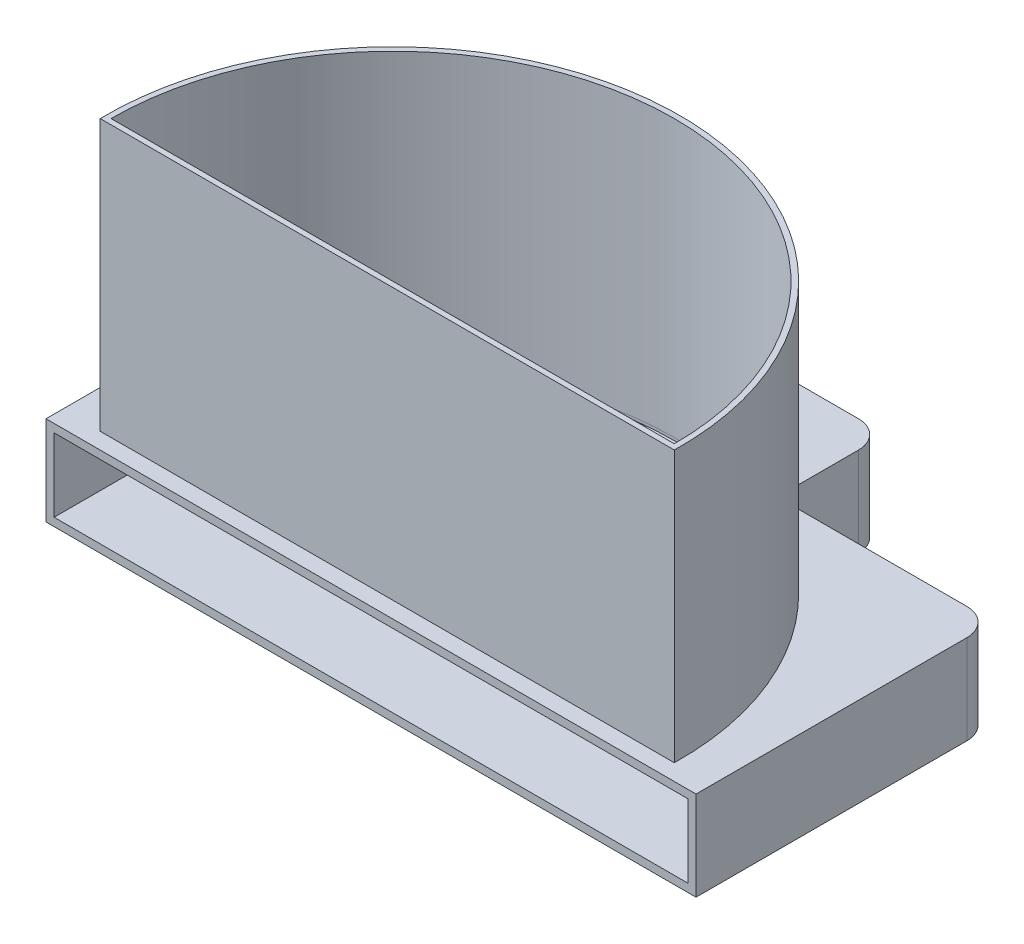
ISO-10303-21;
HEADER;
FILE_DESCRIPTION(('STEP AP214'),'2;1');
FILE_NAME('part.step','',(''),(''),'','','');
FILE_SCHEMA(('AUTOMOTIVE_DESIGN { 1 0 10303 214 1 1 1 1 }'));
ENDSEC;
DATA;
#1=APPLICATION_CONTEXT('core data for automotive mechanical design processes');
#2=APPLICATION_PROTOCOL_DEFINITION('international standard','automotive_design',2000,#1);
#3=PRODUCT_CONTEXT('',#1,'mechanical');
#4=PRODUCT('Part','Part','',(#3));
#5=PRODUCT_RELATED_PRODUCT_CATEGORY('part','',(#4));
#6=PRODUCT_DEFINITION_FORMATION('','',#4);
#7=PRODUCT_DEFINITION_CONTEXT('part definition',#1,'design');
#8=PRODUCT_DEFINITION('design','',#6,#7);
#9=PRODUCT_DEFINITION_SHAPE('','',#8);
#10=(LENGTH_UNIT() NAMED_UNIT(*) SI_UNIT(.MILLI.,.METRE.));
#11=(NAMED_UNIT(*) PLANE_ANGLE_UNIT() SI_UNIT($,.RADIAN.));
#12=(NAMED_UNIT(*) SI_UNIT($,.STERADIAN.) SOLID_ANGLE_UNIT());
#13=UNCERTAINTY_MEASURE_WITH_UNIT(LENGTH_MEASURE(1.E-05),#10,'distance_accuracy_value','');
#14=(GEOMETRIC_REPRESENTATION_CONTEXT(3) GLOBAL_UNCERTAINTY_ASSIGNED_CONTEXT((#13)) GLOBAL_UNIT_ASSIGNED_CONTEXT((#10,
#11,#12)) REPRESENTATION_CONTEXT('',''));
#15=CARTESIAN_POINT('',(0.,0.,0.));
#16=DIRECTION('',(0.,0.,1.));
#17=DIRECTION('',(1.,0.,0.));
#18=AXIS2_PLACEMENT_3D('',#15,#16,#17);
#19=CARTESIAN_POINT('',(0.,31.,67.));
#20=DIRECTION('',(0.,-1.,0.));
#21=DIRECTION('',(0.,0.,-1.));
#22=AXIS2_PLACEMENT_3D('',#19,#20,#21);
#23=PLANE('',#22);
#24=CARTESIAN_POINT('',(0.,31.,67.));
#25=DIRECTION('',(0.,-1.,0.));
#26=DIRECTION('',(0.,0.,-1.));
#27=AXIS2_PLACEMENT_3D('',#24,#25,#26);
#28=CIRCLE('',#27,106.);
#29=CARTESIAN_POINT('',(105.981130395934,31.,69.));
#30=VERTEX_POINT('',#29);
#31=CARTESIAN_POINT('',(-105.981130395934,31.,69.));
#32=VERTEX_POINT('',#31);
#33=EDGE_CURVE('E95',#30,#32,#28,.F.);
#34=ORIENTED_EDGE('',*,*,#33,.F.);
#35=DIRECTION('',(1.,0.,0.));
#36=VECTOR('',#35,1.);
#37=CARTESIAN_POINT('',(0.,31.,69.));
#38=LINE('',#37,#36);
#39=EDGE_CURVE('E111',#32,#30,#38,.T.);
#40=ORIENTED_EDGE('',*,*,#39,.F.);
#41=EDGE_LOOP('',(#34,#40));
#42=FACE_BOUND('',#41,.T.);
#43=DIRECTION('',(1.,0.,0.));
#44=VECTOR('',#43,1.);
#45=CARTESIAN_POINT('',(0.,31.,67.));
#46=LINE('',#45,#44);
#47=CARTESIAN_POINT('',(-104.,31.,67.));
#48=VERTEX_POINT('',#47);
#49=CARTESIAN_POINT('',(104.,31.,67.));
#50=VERTEX_POINT('',#49);
#51=EDGE_CURVE('E60',#48,#50,#46,.T.);
#52=ORIENTED_EDGE('',*,*,#51,.T.);
#53=CARTESIAN_POINT('',(0.,31.,67.));
#54=DIRECTION('',(0.,-1.,0.));
#55=DIRECTION('',(0.,0.,-1.));
#56=AXIS2_PLACEMENT_3D('',#53,#54,#55);
#57=CIRCLE('',#56,104.);
#58=EDGE_CURVE('E12',#50,#48,#57,.F.);
#59=ORIENTED_EDGE('',*,*,#58,.T.);
#60=EDGE_LOOP('',(#52,#59));
#61=FACE_BOUND('',#60,.T.);
#62=ADVANCED_FACE('F53',(#42,#61),#23,.T.);
#63=CARTESIAN_POINT('',(0.,133.,67.));
#64=DIRECTION('',(0.,-1.,0.));
#65=DIRECTION('',(0.,0.,-1.));
#66=AXIS2_PLACEMENT_3D('',#63,#64,#65);
#67=PLANE('',#66);
#68=CARTESIAN_POINT('',(0.,133.,67.));
#69=DIRECTION('',(0.,-1.,0.));
#70=DIRECTION('',(0.,0.,-1.));
#71=AXIS2_PLACEMENT_3D('',#68,#69,#70);
#72=CIRCLE('',#71,106.);
#73=CARTESIAN_POINT('',(105.981130395934,133.,69.));
#74=VERTEX_POINT('',#73);
#75=CARTESIAN_POINT('',(-105.981130395934,133.,69.));
#76=VERTEX_POINT('',#75);
#77=EDGE_CURVE('E117',#74,#76,#72,.F.);
#78=ORIENTED_EDGE('',*,*,#77,.T.);
#79=DIRECTION('',(1.,0.,0.));
#80=VECTOR('',#79,1.);
#81=CARTESIAN_POINT('',(0.,133.,69.));
#82=LINE('',#81,#80);
#83=EDGE_CURVE('E123',#76,#74,#82,.T.);
#84=ORIENTED_EDGE('',*,*,#83,.T.);
#85=EDGE_LOOP('',(#78,#84));
#86=FACE_BOUND('',#85,.T.);
#87=CARTESIAN_POINT('',(0.,133.,67.));
#88=DIRECTION('',(0.,1.,0.));
#89=DIRECTION('',(0.,0.,-1.));
#90=AXIS2_PLACEMENT_3D('',#87,#88,#89);
#91=CIRCLE('',#90,104.);
#92=CARTESIAN_POINT('',(104.,133.,67.));
#93=VERTEX_POINT('',#92);
#94=CARTESIAN_POINT('',(-104.,133.,67.));
#95=VERTEX_POINT('',#94);
#96=EDGE_CURVE('E93',#93,#95,#91,.T.);
#97=ORIENTED_EDGE('',*,*,#96,.F.);
#98=DIRECTION('',(1.,0.,0.));
#99=VECTOR('',#98,1.);
#100=CARTESIAN_POINT('',(-104.,133.,67.));
#101=LINE('',#100,#99);
#102=EDGE_CURVE('E191',#95,#93,#101,.T.);
#103=ORIENTED_EDGE('',*,*,#102,.F.);
#104=EDGE_LOOP('',(#97,#103));
#105=FACE_BOUND('',#104,.T.);
#106=ADVANCED_FACE('F101',(#86,#105),#67,.F.);
#107=CARTESIAN_POINT('',(0.,133.,67.));
#108=DIRECTION('',(0.,-1.,0.));
#109=DIRECTION('',(0.,0.,-1.));
#110=AXIS2_PLACEMENT_3D('',#107,#108,#109);
#111=CYLINDRICAL_SURFACE('',#110,106.);
#112=ORIENTED_EDGE('',*,*,#33,.T.);
#113=DIRECTION('',(0.,-1.,0.));
#114=VECTOR('',#113,1.);
#115=CARTESIAN_POINT('',(-105.981130395934,133.,69.));
#116=LINE('',#115,#114);
#117=EDGE_CURVE('E99',#76,#32,#116,.T.);
#118=ORIENTED_EDGE('',*,*,#117,.F.);
#119=ORIENTED_EDGE('',*,*,#77,.F.);
#120=DIRECTION('',(0.,-1.,0.));
#121=VECTOR('',#120,1.);
#122=CARTESIAN_POINT('',(105.981130395934,133.,69.));
#123=LINE('',#122,#121);
#124=EDGE_CURVE('E122',#74,#30,#123,.T.);
#125=ORIENTED_EDGE('',*,*,#124,.T.);
#126=EDGE_LOOP('',(#112,#118,#119,#125));
#127=FACE_BOUND('',#126,.T.);
#128=ADVANCED_FACE('F106',(#127),#111,.T.);
#129=CARTESIAN_POINT('',(-104.,133.,69.));
#130=DIRECTION('',(0.,0.,-1.));
#131=DIRECTION('',(-1.,0.,0.));
#132=AXIS2_PLACEMENT_3D('',#129,#130,#131);
#133=PLANE('',#132);
#134=ORIENTED_EDGE('',*,*,#39,.T.);
#135=ORIENTED_EDGE('',*,*,#124,.F.);
#136=ORIENTED_EDGE('',*,*,#83,.F.);
#137=ORIENTED_EDGE('',*,*,#117,.T.);
#138=EDGE_LOOP('',(#134,#135,#136,#137));
#139=FACE_BOUND('',#138,.T.);
#140=ADVANCED_FACE('F131',(#139),#133,.F.);
#141=CARTESIAN_POINT('',(0.,133.,67.));
#142=DIRECTION('',(0.,-1.,0.));
#143=DIRECTION('',(0.,0.,-1.));
#144=AXIS2_PLACEMENT_3D('',#141,#142,#143);
#145=CYLINDRICAL_SURFACE('',#144,104.);
#146=DIRECTION('',(0.,-1.,0.));
#147=VECTOR('',#146,1.);
#148=CARTESIAN_POINT('',(-104.,133.,67.));
#149=LINE('',#148,#147);
#150=EDGE_CURVE('E72',#95,#48,#149,.T.);
#151=ORIENTED_EDGE('',*,*,#150,.T.);
#152=ORIENTED_EDGE('',*,*,#58,.F.);
#153=DIRECTION('',(0.,-1.,0.));
#154=VECTOR('',#153,1.);
#155=CARTESIAN_POINT('',(104.,133.,67.));
#156=LINE('',#155,#154);
#157=EDGE_CURVE('E67',#93,#50,#156,.T.);
#158=ORIENTED_EDGE('',*,*,#157,.F.);
#159=ORIENTED_EDGE('',*,*,#96,.T.);
#160=EDGE_LOOP('',(#151,#152,#158,#159));
#161=FACE_BOUND('',#160,.T.);
#162=ADVANCED_FACE('F90',(#161),#145,.F.);
#163=CARTESIAN_POINT('',(-104.,133.,67.));
#164=DIRECTION('',(0.,0.,-1.));
#165=DIRECTION('',(-1.,0.,0.));
#166=AXIS2_PLACEMENT_3D('',#163,#164,#165);
#167=PLANE('',#166);
#168=ORIENTED_EDGE('',*,*,#157,.T.);
#169=ORIENTED_EDGE('',*,*,#51,.F.);
#170=ORIENTED_EDGE('',*,*,#150,.F.);
#171=ORIENTED_EDGE('',*,*,#102,.T.);
#172=EDGE_LOOP('',(#168,#169,#170,#171));
#173=FACE_BOUND('',#172,.T.);
#174=ADVANCED_FACE('F97',(#173),#167,.T.);
#175=CLOSED_SHELL('',(#62,#106,#128,#140,#162,#174));
#176=MANIFOLD_SOLID_BREP('B2',#175);
#177=CARTESIAN_POINT('',(0.,33.,0.));
#178=DIRECTION('',(0.,1.,0.));
#179=DIRECTION('',(0.,0.,1.));
#180=AXIS2_PLACEMENT_3D('',#177,#178,#179);
#181=PLANE('',#180);
#182=CARTESIAN_POINT('',(-110.,33.,-25.));
#183=DIRECTION('',(0.,1.,0.));
#184=DIRECTION('',(0.,0.,1.));
#185=AXIS2_PLACEMENT_3D('',#182,#183,#184);
#186=CIRCLE('',#185,10.);
#187=CARTESIAN_POINT('',(-110.,33.,-35.));
#188=VERTEX_POINT('',#187);
#189=CARTESIAN_POINT('',(-120.,33.,-25.));
#190=VERTEX_POINT('',#189);
#191=EDGE_CURVE('E548',#188,#190,#186,.T.);
#192=ORIENTED_EDGE('',*,*,#191,.T.);
#193=DIRECTION('',(0.,0.,1.));
#194=VECTOR('',#193,1.);
#195=CARTESIAN_POINT('',(-120.,33.,-35.));
#196=LINE('',#195,#194);
#197=CARTESIAN_POINT('',(-120.,33.,75.));
#198=VERTEX_POINT('',#197);
#199=EDGE_CURVE('E478',#190,#198,#196,.T.);
#200=ORIENTED_EDGE('',*,*,#199,.T.);
#201=DIRECTION('',(1.,0.,0.));
#202=VECTOR('',#201,1.);
#203=CARTESIAN_POINT('',(-120.,33.,75.));
#204=LINE('',#203,#202);
#205=CARTESIAN_POINT('',(120.,33.,75.));
#206=VERTEX_POINT('',#205);
#207=EDGE_CURVE('E481',#198,#206,#204,.T.);
#208=ORIENTED_EDGE('',*,*,#207,.T.);
#209=DIRECTION('',(0.,0.,-1.));
#210=VECTOR('',#209,1.);
#211=CARTESIAN_POINT('',(120.,33.,-35.));
#212=LINE('',#211,#210);
#213=CARTESIAN_POINT('',(120.,33.,-25.));
#214=VERTEX_POINT('',#213);
#215=EDGE_CURVE('E455',#206,#214,#212,.T.);
#216=ORIENTED_EDGE('',*,*,#215,.T.);
#217=CARTESIAN_POINT('',(110.,33.,-25.));
#218=DIRECTION('',(0.,1.,0.));
#219=DIRECTION('',(0.,0.,1.));
#220=AXIS2_PLACEMENT_3D('',#217,#218,#219);
#221=CIRCLE('',#220,10.);
#222=CARTESIAN_POINT('',(110.,33.,-35.));
#223=VERTEX_POINT('',#222);
#224=EDGE_CURVE('E551',#214,#223,#221,.T.);
#225=ORIENTED_EDGE('',*,*,#224,.T.);
#226=DIRECTION('',(-1.,0.,0.));
#227=VECTOR('',#226,1.);
#228=CARTESIAN_POINT('',(40.,33.,-35.));
#229=LINE('',#228,#227);
#230=CARTESIAN_POINT('',(40.,33.,-35.));
#231=VERTEX_POINT('',#230);
#232=EDGE_CURVE('E459',#223,#231,#229,.T.);
#233=ORIENTED_EDGE('',*,*,#232,.T.);
#234=DIRECTION('',(0.,0.,-1.));
#235=VECTOR('',#234,1.);
#236=CARTESIAN_POINT('',(40.,33.,-75.));
#237=LINE('',#236,#235);
#238=CARTESIAN_POINT('',(40.,33.,-65.));
#239=VERTEX_POINT('',#238);
#240=EDGE_CURVE('E463',#231,#239,#237,.T.);
#241=ORIENTED_EDGE('',*,*,#240,.T.);
#242=CARTESIAN_POINT('',(30.,33.,-65.));
#243=DIRECTION('',(0.,1.,0.));
#244=DIRECTION('',(0.,0.,1.));
#245=AXIS2_PLACEMENT_3D('',#242,#243,#244);
#246=CIRCLE('',#245,10.);
#247=CARTESIAN_POINT('',(30.,33.,-75.));
#248=VERTEX_POINT('',#247);
#249=EDGE_CURVE('E557',#239,#248,#246,.T.);
#250=ORIENTED_EDGE('',*,*,#249,.T.);
#251=DIRECTION('',(-1.,0.,0.));
#252=VECTOR('',#251,1.);
#253=CARTESIAN_POINT('',(-40.,33.,-75.));
#254=LINE('',#253,#252);
#255=CARTESIAN_POINT('',(-30.,33.,-75.));
#256=VERTEX_POINT('',#255);
#257=EDGE_CURVE('E467',#248,#256,#254,.T.);
#258=ORIENTED_EDGE('',*,*,#257,.T.);
#259=CARTESIAN_POINT('',(-30.,33.,-65.));
#260=DIRECTION('',(0.,1.,0.));
#261=DIRECTION('',(0.,0.,1.));
#262=AXIS2_PLACEMENT_3D('',#259,#260,#261);
#263=CIRCLE('',#262,10.);
#264=CARTESIAN_POINT('',(-40.,33.,-65.));
#265=VERTEX_POINT('',#264);
#266=EDGE_CURVE('E554',#256,#265,#263,.T.);
#267=ORIENTED_EDGE('',*,*,#266,.T.);
#268=DIRECTION('',(0.,0.,1.));
#269=VECTOR('',#268,1.);
#270=CARTESIAN_POINT('',(-40.,33.,-35.));
#271=LINE('',#270,#269);
#272=CARTESIAN_POINT('',(-40.,33.,-35.));
#273=VERTEX_POINT('',#272);
#274=EDGE_CURVE('E471',#265,#273,#271,.T.);
#275=ORIENTED_EDGE('',*,*,#274,.T.);
#276=DIRECTION('',(-1.,0.,0.));
#277=VECTOR('',#276,1.);
#278=CARTESIAN_POINT('',(-120.,33.,-35.));
#279=LINE('',#278,#277);
#280=EDGE_CURVE('E474',#273,#188,#279,.T.);
#281=ORIENTED_EDGE('',*,*,#280,.T.);
#282=EDGE_LOOP('',(#192,#200,#208,#216,#225,#233,#241,#250,#258,#267,#275,#281));
#283=FACE_BOUND('',#282,.T.);
#284=DIRECTION('',(1.,0.,0.));
#285=VECTOR('',#284,1.);
#286=CARTESIAN_POINT('',(-104.,33.,67.));
#287=LINE('',#286,#285);
#288=CARTESIAN_POINT('',(-104.,33.,67.));
#289=VERTEX_POINT('',#288);
#290=CARTESIAN_POINT('',(104.,33.,67.));
#291=VERTEX_POINT('',#290);
#292=EDGE_CURVE('E345',#289,#291,#287,.T.);
#293=ORIENTED_EDGE('',*,*,#292,.F.);
#294=CARTESIAN_POINT('',(0.,33.,67.));
#295=DIRECTION('',(0.,1.,0.));
#296=DIRECTION('',(0.,0.,-1.));
#297=AXIS2_PLACEMENT_3D('',#294,#295,#296);
#298=CIRCLE('',#297,104.);
#299=EDGE_CURVE('E352',#291,#289,#298,.T.);
#300=ORIENTED_EDGE('',*,*,#299,.F.);
#301=EDGE_LOOP('',(#293,#300));
#302=FACE_BOUND('',#301,.T.);
#303=ADVANCED_FACE('F197',(#283,#302),#181,.T.);
#304=CARTESIAN_POINT('',(0.,30.,0.));
#305=DIRECTION('',(0.,1.,0.));
#306=DIRECTION('',(0.,0.,1.));
#307=AXIS2_PLACEMENT_3D('',#304,#305,#306);
#308=PLANE('',#307);
#309=DIRECTION('',(-1.,0.,0.));
#310=VECTOR('',#309,1.);
#311=CARTESIAN_POINT('',(-120.,30.,-32.));
#312=LINE('',#311,#310);
#313=CARTESIAN_POINT('',(-37.,30.,-32.));
#314=VERTEX_POINT('',#313);
#315=CARTESIAN_POINT('',(-117.,30.,-32.));
#316=VERTEX_POINT('',#315);
#317=EDGE_CURVE('E394',#314,#316,#312,.T.);
#318=ORIENTED_EDGE('',*,*,#317,.F.);
#319=DIRECTION('',(0.,0.,1.));
#320=VECTOR('',#319,1.);
#321=CARTESIAN_POINT('',(-37.,30.,-72.));
#322=LINE('',#321,#320);
#323=CARTESIAN_POINT('',(-37.,30.,-72.));
#324=VERTEX_POINT('',#323);
#325=EDGE_CURVE('E386',#324,#314,#322,.T.);
#326=ORIENTED_EDGE('',*,*,#325,.F.);
#327=DIRECTION('',(-1.,0.,0.));
#328=VECTOR('',#327,1.);
#329=CARTESIAN_POINT('',(37.,30.,-72.));
#330=LINE('',#329,#328);
#331=CARTESIAN_POINT('',(37.,30.,-72.));
#332=VERTEX_POINT('',#331);
#333=EDGE_CURVE('E382',#332,#324,#330,.T.);
#334=ORIENTED_EDGE('',*,*,#333,.F.);
#335=DIRECTION('',(0.,0.,-1.));
#336=VECTOR('',#335,1.);
#337=CARTESIAN_POINT('',(37.,30.,-32.));
#338=LINE('',#337,#336);
#339=CARTESIAN_POINT('',(37.,30.,-32.));
#340=VERTEX_POINT('',#339);
#341=EDGE_CURVE('E378',#340,#332,#338,.T.);
#342=ORIENTED_EDGE('',*,*,#341,.F.);
#343=DIRECTION('',(-1.,0.,0.));
#344=VECTOR('',#343,1.);
#345=CARTESIAN_POINT('',(117.,30.,-32.));
#346=LINE('',#345,#344);
#347=CARTESIAN_POINT('',(117.,30.,-32.));
#348=VERTEX_POINT('',#347);
#349=EDGE_CURVE('E374',#348,#340,#346,.T.);
#350=ORIENTED_EDGE('',*,*,#349,.F.);
#351=DIRECTION('',(0.,0.,-1.));
#352=VECTOR('',#351,1.);
#353=CARTESIAN_POINT('',(117.,30.,75.));
#354=LINE('',#353,#352);
#355=CARTESIAN_POINT('',(117.,30.,75.));
#356=VERTEX_POINT('',#355);
#357=EDGE_CURVE('E370',#356,#348,#354,.T.);
#358=ORIENTED_EDGE('',*,*,#357,.F.);
#359=DIRECTION('',(1.,0.,0.));
#360=VECTOR('',#359,1.);
#361=CARTESIAN_POINT('',(-117.,30.,75.));
#362=LINE('',#361,#360);
#363=CARTESIAN_POINT('',(-117.,30.,75.));
#364=VERTEX_POINT('',#363);
#365=EDGE_CURVE('E367',#364,#356,#362,.T.);
#366=ORIENTED_EDGE('',*,*,#365,.F.);
#367=DIRECTION('',(0.,0.,1.));
#368=VECTOR('',#367,1.);
#369=CARTESIAN_POINT('',(-117.,30.,-35.));
#370=LINE('',#369,#368);
#371=EDGE_CURVE('E390',#316,#364,#370,.T.);
#372=ORIENTED_EDGE('',*,*,#371,.F.);
#373=EDGE_LOOP('',(#318,#326,#334,#342,#350,#358,#366,#372));
#374=FACE_BOUND('',#373,.T.);
#375=CARTESIAN_POINT('',(0.,30.,67.));
#376=DIRECTION('',(0.,1.,0.));
#377=DIRECTION('',(0.,0.,-1.));
#378=AXIS2_PLACEMENT_3D('',#375,#376,#377);
#379=CIRCLE('',#378,104.);
#380=CARTESIAN_POINT('',(104.,30.,67.));
#381=VERTEX_POINT('',#380);
#382=CARTESIAN_POINT('',(-104.,30.,67.));
#383=VERTEX_POINT('',#382);
#384=EDGE_CURVE('E220',#381,#383,#379,.T.);
#385=ORIENTED_EDGE('',*,*,#384,.T.);
#386=DIRECTION('',(1.,0.,0.));
#387=VECTOR('',#386,1.);
#388=CARTESIAN_POINT('',(-104.,30.,67.));
#389=LINE('',#388,#387);
#390=EDGE_CURVE('E358',#383,#381,#389,.T.);
#391=ORIENTED_EDGE('',*,*,#390,.T.);
#392=EDGE_LOOP('',(#385,#391));
#393=FACE_BOUND('',#392,.T.);
#394=ADVANCED_FACE('F637',(#374,#393),#308,.F.);
#395=CARTESIAN_POINT('',(117.,33.,-35.));
#396=DIRECTION('',(-1.,0.,0.));
#397=DIRECTION('',(0.,0.,1.));
#398=AXIS2_PLACEMENT_3D('',#395,#396,#397);
#399=PLANE('',#398);
#400=DIRECTION('',(0.,-1.,0.));
#401=VECTOR('',#400,1.);
#402=CARTESIAN_POINT('',(117.,33.,75.));
#403=LINE('',#402,#401);
#404=CARTESIAN_POINT('',(117.,3.,75.));
#405=VERTEX_POINT('',#404);
#406=EDGE_CURVE('E449',#356,#405,#403,.T.);
#407=ORIENTED_EDGE('',*,*,#406,.F.);
#408=ORIENTED_EDGE('',*,*,#357,.T.);
#409=DIRECTION('',(0.,-1.,0.));
#410=VECTOR('',#409,1.);
#411=CARTESIAN_POINT('',(117.,33.,-32.));
#412=LINE('',#411,#410);
#413=CARTESIAN_POINT('',(117.,3.,-32.));
#414=VERTEX_POINT('',#413);
#415=EDGE_CURVE('E403',#348,#414,#412,.T.);
#416=ORIENTED_EDGE('',*,*,#415,.T.);
#417=DIRECTION('',(0.,0.,-1.));
#418=VECTOR('',#417,1.);
#419=CARTESIAN_POINT('',(117.,3.,-35.));
#420=LINE('',#419,#418);
#421=EDGE_CURVE('E398',#405,#414,#420,.T.);
#422=ORIENTED_EDGE('',*,*,#421,.F.);
#423=EDGE_LOOP('',(#407,#408,#416,#422));
#424=FACE_BOUND('',#423,.T.);
#425=ADVANCED_FACE('F642',(#424),#399,.T.);
#426=CARTESIAN_POINT('',(40.,33.,-32.));
#427=DIRECTION('',(0.,0.,1.));
#428=DIRECTION('',(1.,0.,0.));
#429=AXIS2_PLACEMENT_3D('',#426,#427,#428);
#430=PLANE('',#429);
#431=ORIENTED_EDGE('',*,*,#415,.F.);
#432=ORIENTED_EDGE('',*,*,#349,.T.);
#433=DIRECTION('',(0.,-1.,0.));
#434=VECTOR('',#433,1.);
#435=CARTESIAN_POINT('',(37.,33.,-32.));
#436=LINE('',#435,#434);
#437=CARTESIAN_POINT('',(37.,3.,-32.));
#438=VERTEX_POINT('',#437);
#439=EDGE_CURVE('E407',#340,#438,#436,.T.);
#440=ORIENTED_EDGE('',*,*,#439,.T.);
#441=DIRECTION('',(-1.,0.,0.));
#442=VECTOR('',#441,1.);
#443=CARTESIAN_POINT('',(40.,3.,-32.));
#444=LINE('',#443,#442);
#445=EDGE_CURVE('E402',#414,#438,#444,.T.);
#446=ORIENTED_EDGE('',*,*,#445,.F.);
#447=EDGE_LOOP('',(#431,#432,#440,#446));
#448=FACE_BOUND('',#447,.T.);
#449=ADVANCED_FACE('F692',(#448),#430,.T.);
#450=CARTESIAN_POINT('',(37.,33.,-75.));
#451=DIRECTION('',(-1.,0.,0.));
#452=DIRECTION('',(0.,0.,1.));
#453=AXIS2_PLACEMENT_3D('',#450,#451,#452);
#454=PLANE('',#453);
#455=ORIENTED_EDGE('',*,*,#439,.F.);
#456=ORIENTED_EDGE('',*,*,#341,.T.);
#457=DIRECTION('',(0.,-1.,0.));
#458=VECTOR('',#457,1.);
#459=CARTESIAN_POINT('',(37.,33.,-72.));
#460=LINE('',#459,#458);
#461=CARTESIAN_POINT('',(37.,3.,-72.));
#462=VERTEX_POINT('',#461);
#463=EDGE_CURVE('E414',#332,#462,#460,.T.);
#464=ORIENTED_EDGE('',*,*,#463,.T.);
#465=DIRECTION('',(0.,0.,-1.));
#466=VECTOR('',#465,1.);
#467=CARTESIAN_POINT('',(37.,3.,-75.));
#468=LINE('',#467,#466);
#469=EDGE_CURVE('E411',#438,#462,#468,.T.);
#470=ORIENTED_EDGE('',*,*,#469,.F.);
#471=EDGE_LOOP('',(#455,#456,#464,#470));
#472=FACE_BOUND('',#471,.T.);
#473=ADVANCED_FACE('F703',(#472),#454,.T.);
#474=CARTESIAN_POINT('',(-40.,33.,-72.));
#475=DIRECTION('',(0.,0.,1.));
#476=DIRECTION('',(1.,0.,0.));
#477=AXIS2_PLACEMENT_3D('',#474,#475,#476);
#478=PLANE('',#477);
#479=ORIENTED_EDGE('',*,*,#463,.F.);
#480=ORIENTED_EDGE('',*,*,#333,.T.);
#481=DIRECTION('',(0.,-1.,0.));
#482=VECTOR('',#481,1.);
#483=CARTESIAN_POINT('',(-37.,33.,-72.));
#484=LINE('',#483,#482);
#485=CARTESIAN_POINT('',(-37.,3.,-72.));
#486=VERTEX_POINT('',#485);
#487=EDGE_CURVE('E421',#324,#486,#484,.T.);
#488=ORIENTED_EDGE('',*,*,#487,.T.);
#489=DIRECTION('',(-1.,0.,0.));
#490=VECTOR('',#489,1.);
#491=CARTESIAN_POINT('',(-40.,3.,-72.));
#492=LINE('',#491,#490);
#493=EDGE_CURVE('E418',#462,#486,#492,.T.);
#494=ORIENTED_EDGE('',*,*,#493,.F.);
#495=EDGE_LOOP('',(#479,#480,#488,#494));
#496=FACE_BOUND('',#495,.T.);
#497=ADVANCED_FACE('F713',(#496),#478,.T.);
#498=CARTESIAN_POINT('',(-37.,33.,-35.));
#499=DIRECTION('',(1.,0.,0.));
#500=DIRECTION('',(0.,0.,-1.));
#501=AXIS2_PLACEMENT_3D('',#498,#499,#500);
#502=PLANE('',#501);
#503=ORIENTED_EDGE('',*,*,#487,.F.);
#504=ORIENTED_EDGE('',*,*,#325,.T.);
#505=DIRECTION('',(0.,-1.,0.));
#506=VECTOR('',#505,1.);
#507=CARTESIAN_POINT('',(-37.,33.,-32.));
#508=LINE('',#507,#506);
#509=CARTESIAN_POINT('',(-37.,3.,-32.));
#510=VERTEX_POINT('',#509);
#511=EDGE_CURVE('E428',#314,#510,#508,.T.);
#512=ORIENTED_EDGE('',*,*,#511,.T.);
#513=DIRECTION('',(0.,0.,1.));
#514=VECTOR('',#513,1.);
#515=CARTESIAN_POINT('',(-37.,3.,-35.));
#516=LINE('',#515,#514);
#517=EDGE_CURVE('E425',#486,#510,#516,.T.);
#518=ORIENTED_EDGE('',*,*,#517,.F.);
#519=EDGE_LOOP('',(#503,#504,#512,#518));
#520=FACE_BOUND('',#519,.T.);
#521=ADVANCED_FACE('F723',(#520),#502,.T.);
#522=CARTESIAN_POINT('',(-120.,33.,-32.));
#523=DIRECTION('',(0.,0.,1.));
#524=DIRECTION('',(1.,0.,0.));
#525=AXIS2_PLACEMENT_3D('',#522,#523,#524);
#526=PLANE('',#525);
#527=ORIENTED_EDGE('',*,*,#511,.F.);
#528=ORIENTED_EDGE('',*,*,#317,.T.);
#529=DIRECTION('',(0.,-1.,0.));
#530=VECTOR('',#529,1.);
#531=CARTESIAN_POINT('',(-117.,33.,-32.));
#532=LINE('',#531,#530);
#533=CARTESIAN_POINT('',(-117.,3.,-32.));
#534=VERTEX_POINT('',#533);
#535=EDGE_CURVE('E435',#316,#534,#532,.T.);
#536=ORIENTED_EDGE('',*,*,#535,.T.);
#537=DIRECTION('',(-1.,0.,0.));
#538=VECTOR('',#537,1.);
#539=CARTESIAN_POINT('',(-120.,3.,-32.));
#540=LINE('',#539,#538);
#541=EDGE_CURVE('E432',#510,#534,#540,.T.);
#542=ORIENTED_EDGE('',*,*,#541,.F.);
#543=EDGE_LOOP('',(#527,#528,#536,#542));
#544=FACE_BOUND('',#543,.T.);
#545=ADVANCED_FACE('F733',(#544),#526,.T.);
#546=CARTESIAN_POINT('',(-117.,33.,-35.));
#547=DIRECTION('',(1.,0.,0.));
#548=DIRECTION('',(0.,0.,-1.));
#549=AXIS2_PLACEMENT_3D('',#546,#547,#548);
#550=PLANE('',#549);
#551=ORIENTED_EDGE('',*,*,#535,.F.);
#552=ORIENTED_EDGE('',*,*,#371,.T.);
#553=DIRECTION('',(0.,-1.,0.));
#554=VECTOR('',#553,1.);
#555=CARTESIAN_POINT('',(-117.,33.,75.));
#556=LINE('',#555,#554);
#557=CARTESIAN_POINT('',(-117.,3.,75.));
#558=VERTEX_POINT('',#557);
#559=EDGE_CURVE('E442',#364,#558,#556,.T.);
#560=ORIENTED_EDGE('',*,*,#559,.T.);
#561=DIRECTION('',(0.,0.,1.));
#562=VECTOR('',#561,1.);
#563=CARTESIAN_POINT('',(-117.,3.,-35.));
#564=LINE('',#563,#562);
#565=EDGE_CURVE('E439',#534,#558,#564,.T.);
#566=ORIENTED_EDGE('',*,*,#565,.F.);
#567=EDGE_LOOP('',(#551,#552,#560,#566));
#568=FACE_BOUND('',#567,.T.);
#569=ADVANCED_FACE('F668',(#568),#550,.T.);
#570=CARTESIAN_POINT('',(120.,33.,-35.));
#571=DIRECTION('',(-1.,0.,0.));
#572=DIRECTION('',(0.,0.,1.));
#573=AXIS2_PLACEMENT_3D('',#570,#571,#572);
#574=PLANE('',#573);
#575=DIRECTION('',(0.,0.,-1.));
#576=VECTOR('',#575,1.);
#577=CARTESIAN_POINT('',(120.,0.,-35.));
#578=LINE('',#577,#576);
#579=CARTESIAN_POINT('',(120.,0.,75.));
#580=VERTEX_POINT('',#579);
#581=CARTESIAN_POINT('',(120.,0.,-25.));
#582=VERTEX_POINT('',#581);
#583=EDGE_CURVE('E406',#580,#582,#578,.T.);
#584=ORIENTED_EDGE('',*,*,#583,.T.);
#585=DIRECTION('',(0.,-1.,0.));
#586=VECTOR('',#585,1.);
#587=CARTESIAN_POINT('',(120.,33.,-25.));
#588=LINE('',#587,#586);
#589=EDGE_CURVE('E568',#582,#214,#588,.F.);
#590=ORIENTED_EDGE('',*,*,#589,.T.);
#591=ORIENTED_EDGE('',*,*,#215,.F.);
#592=DIRECTION('',(0.,-1.,0.));
#593=VECTOR('',#592,1.);
#594=CARTESIAN_POINT('',(120.,33.,75.));
#595=LINE('',#594,#593);
#596=EDGE_CURVE('E484',#206,#580,#595,.T.);
#597=ORIENTED_EDGE('',*,*,#596,.T.);
#598=EDGE_LOOP('',(#584,#590,#591,#597));
#599=FACE_BOUND('',#598,.T.);
#600=ADVANCED_FACE('F592',(#599),#574,.F.);
#601=CARTESIAN_POINT('',(40.,33.,-35.));
#602=DIRECTION('',(0.,0.,1.));
#603=DIRECTION('',(1.,0.,0.));
#604=AXIS2_PLACEMENT_3D('',#601,#602,#603);
#605=PLANE('',#604);
#606=ORIENTED_EDGE('',*,*,#232,.F.);
#607=DIRECTION('',(0.,-1.,0.));
#608=VECTOR('',#607,1.);
#609=CARTESIAN_POINT('',(110.,33.,-35.));
#610=LINE('',#609,#608);
#611=CARTESIAN_POINT('',(110.,0.,-35.));
#612=VERTEX_POINT('',#611);
#613=EDGE_CURVE('E564',#223,#612,#610,.T.);
#614=ORIENTED_EDGE('',*,*,#613,.T.);
#615=DIRECTION('',(-1.,0.,0.));
#616=VECTOR('',#615,1.);
#617=CARTESIAN_POINT('',(40.,0.,-35.));
#618=LINE('',#617,#616);
#619=CARTESIAN_POINT('',(40.,0.,-35.));
#620=VERTEX_POINT('',#619);
#621=EDGE_CURVE('E488',#612,#620,#618,.T.);
#622=ORIENTED_EDGE('',*,*,#621,.T.);
#623=DIRECTION('',(0.,-1.,0.));
#624=VECTOR('',#623,1.);
#625=CARTESIAN_POINT('',(40.,33.,-35.));
#626=LINE('',#625,#624);
#627=EDGE_CURVE('E522',#231,#620,#626,.T.);
#628=ORIENTED_EDGE('',*,*,#627,.F.);
#629=EDGE_LOOP('',(#606,#614,#622,#628));
#630=FACE_BOUND('',#629,.T.);
#631=ADVANCED_FACE('F602',(#630),#605,.F.);
#632=CARTESIAN_POINT('',(40.,33.,-75.));
#633=DIRECTION('',(-1.,0.,0.));
#634=DIRECTION('',(0.,0.,1.));
#635=AXIS2_PLACEMENT_3D('',#632,#633,#634);
#636=PLANE('',#635);
#637=DIRECTION('',(0.,0.,-1.));
#638=VECTOR('',#637,1.);
#639=CARTESIAN_POINT('',(40.,0.,-75.));
#640=LINE('',#639,#638);
#641=CARTESIAN_POINT('',(40.,0.,-65.));
#642=VERTEX_POINT('',#641);
#643=EDGE_CURVE('E491',#620,#642,#640,.T.);
#644=ORIENTED_EDGE('',*,*,#643,.T.);
#645=DIRECTION('',(0.,-1.,0.));
#646=VECTOR('',#645,1.);
#647=CARTESIAN_POINT('',(40.,33.,-65.));
#648=LINE('',#647,#646);
#649=EDGE_CURVE('E545',#642,#239,#648,.F.);
#650=ORIENTED_EDGE('',*,*,#649,.T.);
#651=ORIENTED_EDGE('',*,*,#240,.F.);
#652=ORIENTED_EDGE('',*,*,#627,.T.);
#653=EDGE_LOOP('',(#644,#650,#651,#652));
#654=FACE_BOUND('',#653,.T.);
#655=ADVANCED_FACE('F607',(#654),#636,.F.);
#656=CARTESIAN_POINT('',(-40.,33.,-75.));
#657=DIRECTION('',(0.,0.,1.));
#658=DIRECTION('',(1.,0.,0.));
#659=AXIS2_PLACEMENT_3D('',#656,#657,#658);
#660=PLANE('',#659);
#661=ORIENTED_EDGE('',*,*,#257,.F.);
#662=DIRECTION('',(0.,-1.,0.));
#663=VECTOR('',#662,1.);
#664=CARTESIAN_POINT('',(30.,33.,-75.));
#665=LINE('',#664,#663);
#666=CARTESIAN_POINT('',(30.,0.,-75.));
#667=VERTEX_POINT('',#666);
#668=EDGE_CURVE('E529',#248,#667,#665,.T.);
#669=ORIENTED_EDGE('',*,*,#668,.T.);
#670=DIRECTION('',(-1.,0.,0.));
#671=VECTOR('',#670,1.);
#672=CARTESIAN_POINT('',(-40.,0.,-75.));
#673=LINE('',#672,#671);
#674=CARTESIAN_POINT('',(-30.,0.,-75.));
#675=VERTEX_POINT('',#674);
#676=EDGE_CURVE('E495',#667,#675,#673,.T.);
#677=ORIENTED_EDGE('',*,*,#676,.T.);
#678=DIRECTION('',(0.,-1.,0.));
#679=VECTOR('',#678,1.);
#680=CARTESIAN_POINT('',(-30.,33.,-75.));
#681=LINE('',#680,#679);
#682=EDGE_CURVE('E526',#675,#256,#681,.F.);
#683=ORIENTED_EDGE('',*,*,#682,.T.);
#684=EDGE_LOOP('',(#661,#669,#677,#683));
#685=FACE_BOUND('',#684,.T.);
#686=ADVANCED_FACE('F616',(#685),#660,.F.);
#687=CARTESIAN_POINT('',(-40.,33.,-35.));
#688=DIRECTION('',(1.,0.,0.));
#689=DIRECTION('',(0.,0.,-1.));
#690=AXIS2_PLACEMENT_3D('',#687,#688,#689);
#691=PLANE('',#690);
#692=ORIENTED_EDGE('',*,*,#274,.F.);
#693=DIRECTION('',(0.,-1.,0.));
#694=VECTOR('',#693,1.);
#695=CARTESIAN_POINT('',(-40.,33.,-65.));
#696=LINE('',#695,#694);
#697=CARTESIAN_POINT('',(-40.,0.,-65.));
#698=VERTEX_POINT('',#697);
#699=EDGE_CURVE('E560',#265,#698,#696,.T.);
#700=ORIENTED_EDGE('',*,*,#699,.T.);
#701=DIRECTION('',(0.,0.,1.));
#702=VECTOR('',#701,1.);
#703=CARTESIAN_POINT('',(-40.,0.,-35.));
#704=LINE('',#703,#702);
#705=CARTESIAN_POINT('',(-40.,0.,-35.));
#706=VERTEX_POINT('',#705);
#707=EDGE_CURVE('E499',#698,#706,#704,.T.);
#708=ORIENTED_EDGE('',*,*,#707,.T.);
#709=DIRECTION('',(0.,-1.,0.));
#710=VECTOR('',#709,1.);
#711=CARTESIAN_POINT('',(-40.,33.,-35.));
#712=LINE('',#711,#710);
#713=EDGE_CURVE('E518',#273,#706,#712,.T.);
#714=ORIENTED_EDGE('',*,*,#713,.F.);
#715=EDGE_LOOP('',(#692,#700,#708,#714));
#716=FACE_BOUND('',#715,.T.);
#717=ADVANCED_FACE('F624',(#716),#691,.F.);
#718=CARTESIAN_POINT('',(-120.,33.,-35.));
#719=DIRECTION('',(0.,0.,1.));
#720=DIRECTION('',(1.,0.,0.));
#721=AXIS2_PLACEMENT_3D('',#718,#719,#720);
#722=PLANE('',#721);
#723=DIRECTION('',(-1.,0.,0.));
#724=VECTOR('',#723,1.);
#725=CARTESIAN_POINT('',(-120.,0.,-35.));
#726=LINE('',#725,#724);
#727=CARTESIAN_POINT('',(-110.,0.,-35.));
#728=VERTEX_POINT('',#727);
#729=EDGE_CURVE('E502',#706,#728,#726,.T.);
#730=ORIENTED_EDGE('',*,*,#729,.T.);
#731=DIRECTION('',(0.,-1.,0.));
#732=VECTOR('',#731,1.);
#733=CARTESIAN_POINT('',(-110.,33.,-35.));
#734=LINE('',#733,#732);
#735=EDGE_CURVE('E51',#728,#188,#734,.F.);
#736=ORIENTED_EDGE('',*,*,#735,.T.);
#737=ORIENTED_EDGE('',*,*,#280,.F.);
#738=ORIENTED_EDGE('',*,*,#713,.T.);
#739=EDGE_LOOP('',(#730,#736,#737,#738));
#740=FACE_BOUND('',#739,.T.);
#741=ADVANCED_FACE('F628',(#740),#722,.F.);
#742=CARTESIAN_POINT('',(-120.,33.,-35.));
#743=DIRECTION('',(1.,0.,0.));
#744=DIRECTION('',(0.,0.,-1.));
#745=AXIS2_PLACEMENT_3D('',#742,#743,#744);
#746=PLANE('',#745);
#747=ORIENTED_EDGE('',*,*,#199,.F.);
#748=DIRECTION('',(0.,-1.,0.));
#749=VECTOR('',#748,1.);
#750=CARTESIAN_POINT('',(-120.,33.,-25.));
#751=LINE('',#750,#749);
#752=CARTESIAN_POINT('',(-120.,0.,-25.));
#753=VERTEX_POINT('',#752);
#754=EDGE_CURVE('E206',#190,#753,#751,.T.);
#755=ORIENTED_EDGE('',*,*,#754,.T.);
#756=DIRECTION('',(0.,0.,1.));
#757=VECTOR('',#756,1.);
#758=CARTESIAN_POINT('',(-120.,0.,-35.));
#759=LINE('',#758,#757);
#760=CARTESIAN_POINT('',(-120.,0.,75.));
#761=VERTEX_POINT('',#760);
#762=EDGE_CURVE('E506',#753,#761,#759,.T.);
#763=ORIENTED_EDGE('',*,*,#762,.T.);
#764=DIRECTION('',(0.,-1.,0.));
#765=VECTOR('',#764,1.);
#766=CARTESIAN_POINT('',(-120.,33.,75.));
#767=LINE('',#766,#765);
#768=EDGE_CURVE('E514',#198,#761,#767,.T.);
#769=ORIENTED_EDGE('',*,*,#768,.F.);
#770=EDGE_LOOP('',(#747,#755,#763,#769));
#771=FACE_BOUND('',#770,.T.);
#772=ADVANCED_FACE('F576',(#771),#746,.F.);
#773=CARTESIAN_POINT('',(-120.,33.,75.));
#774=DIRECTION('',(0.,0.,-1.));
#775=DIRECTION('',(-1.,0.,0.));
#776=AXIS2_PLACEMENT_3D('',#773,#774,#775);
#777=PLANE('',#776);
#778=ORIENTED_EDGE('',*,*,#365,.T.);
#779=ORIENTED_EDGE('',*,*,#406,.T.);
#780=DIRECTION('',(1.,0.,0.));
#781=VECTOR('',#780,1.);
#782=CARTESIAN_POINT('',(-120.,3.,75.));
#783=LINE('',#782,#781);
#784=EDGE_CURVE('E446',#558,#405,#783,.T.);
#785=ORIENTED_EDGE('',*,*,#784,.F.);
#786=ORIENTED_EDGE('',*,*,#559,.F.);
#787=EDGE_LOOP('',(#778,#779,#785,#786));
#788=FACE_BOUND('',#787,.T.);
#789=ORIENTED_EDGE('',*,*,#596,.F.);
#790=ORIENTED_EDGE('',*,*,#207,.F.);
#791=ORIENTED_EDGE('',*,*,#768,.T.);
#792=DIRECTION('',(1.,0.,0.));
#793=VECTOR('',#792,1.);
#794=CARTESIAN_POINT('',(-120.,0.,75.));
#795=LINE('',#794,#793);
#796=EDGE_CURVE('E460',#761,#580,#795,.T.);
#797=ORIENTED_EDGE('',*,*,#796,.T.);
#798=EDGE_LOOP('',(#789,#790,#791,#797));
#799=FACE_BOUND('',#798,.T.);
#800=ADVANCED_FACE('F588',(#788,#799),#777,.F.);
#801=CARTESIAN_POINT('',(0.,0.,0.));
#802=DIRECTION('',(0.,1.,0.));
#803=DIRECTION('',(0.,0.,1.));
#804=AXIS2_PLACEMENT_3D('',#801,#802,#803);
#805=PLANE('',#804);
#806=ORIENTED_EDGE('',*,*,#676,.F.);
#807=CARTESIAN_POINT('',(30.,0.,-65.));
#808=DIRECTION('',(0.,1.,0.));
#809=DIRECTION('',(0.,0.,1.));
#810=AXIS2_PLACEMENT_3D('',#807,#808,#809);
#811=CIRCLE('',#810,10.);
#812=EDGE_CURVE('E542',#667,#642,#811,.F.);
#813=ORIENTED_EDGE('',*,*,#812,.T.);
#814=ORIENTED_EDGE('',*,*,#643,.F.);
#815=ORIENTED_EDGE('',*,*,#621,.F.);
#816=CARTESIAN_POINT('',(110.,0.,-25.));
#817=DIRECTION('',(0.,1.,0.));
#818=DIRECTION('',(0.,0.,1.));
#819=AXIS2_PLACEMENT_3D('',#816,#817,#818);
#820=CIRCLE('',#819,10.);
#821=EDGE_CURVE('E536',#612,#582,#820,.F.);
#822=ORIENTED_EDGE('',*,*,#821,.T.);
#823=ORIENTED_EDGE('',*,*,#583,.F.);
#824=ORIENTED_EDGE('',*,*,#796,.F.);
#825=ORIENTED_EDGE('',*,*,#762,.F.);
#826=CARTESIAN_POINT('',(-110.,0.,-25.));
#827=DIRECTION('',(0.,1.,0.));
#828=DIRECTION('',(0.,0.,1.));
#829=AXIS2_PLACEMENT_3D('',#826,#827,#828);
#830=CIRCLE('',#829,10.);
#831=EDGE_CURVE('E533',#753,#728,#830,.F.);
#832=ORIENTED_EDGE('',*,*,#831,.T.);
#833=ORIENTED_EDGE('',*,*,#729,.F.);
#834=ORIENTED_EDGE('',*,*,#707,.F.);
#835=CARTESIAN_POINT('',(-30.,0.,-65.));
#836=DIRECTION('',(0.,1.,0.));
#837=DIRECTION('',(0.,0.,1.));
#838=AXIS2_PLACEMENT_3D('',#835,#836,#837);
#839=CIRCLE('',#838,10.);
#840=EDGE_CURVE('E539',#698,#675,#839,.F.);
#841=ORIENTED_EDGE('',*,*,#840,.T.);
#842=EDGE_LOOP('',(#806,#813,#814,#815,#822,#823,#824,#825,#832,#833,#834,#841));
#843=FACE_BOUND('',#842,.T.);
#844=ADVANCED_FACE('F583',(#843),#805,.F.);
#845=CARTESIAN_POINT('',(0.,3.,0.));
#846=DIRECTION('',(0.,1.,0.));
#847=DIRECTION('',(0.,0.,1.));
#848=AXIS2_PLACEMENT_3D('',#845,#846,#847);
#849=PLANE('',#848);
#850=ORIENTED_EDGE('',*,*,#421,.T.);
#851=ORIENTED_EDGE('',*,*,#445,.T.);
#852=ORIENTED_EDGE('',*,*,#469,.T.);
#853=ORIENTED_EDGE('',*,*,#493,.T.);
#854=ORIENTED_EDGE('',*,*,#517,.T.);
#855=ORIENTED_EDGE('',*,*,#541,.T.);
#856=ORIENTED_EDGE('',*,*,#565,.T.);
#857=ORIENTED_EDGE('',*,*,#784,.T.);
#858=EDGE_LOOP('',(#850,#851,#852,#853,#854,#855,#856,#857));
#859=FACE_BOUND('',#858,.T.);
#860=ADVANCED_FACE('F647',(#859),#849,.T.);
#861=CARTESIAN_POINT('',(30.,33.,-65.));
#862=DIRECTION('',(0.,-1.,0.));
#863=DIRECTION('',(0.,0.,-1.));
#864=AXIS2_PLACEMENT_3D('',#861,#862,#863);
#865=CYLINDRICAL_SURFACE('',#864,10.);
#866=ORIENTED_EDGE('',*,*,#249,.F.);
#867=ORIENTED_EDGE('',*,*,#649,.F.);
#868=ORIENTED_EDGE('',*,*,#812,.F.);
#869=ORIENTED_EDGE('',*,*,#668,.F.);
#870=EDGE_LOOP('',(#866,#867,#868,#869));
#871=FACE_BOUND('',#870,.T.);
#872=ADVANCED_FACE('F611',(#871),#865,.T.);
#873=CARTESIAN_POINT('',(-30.,33.,-65.));
#874=DIRECTION('',(0.,-1.,0.));
#875=DIRECTION('',(0.,0.,-1.));
#876=AXIS2_PLACEMENT_3D('',#873,#874,#875);
#877=CYLINDRICAL_SURFACE('',#876,10.);
#878=ORIENTED_EDGE('',*,*,#266,.F.);
#879=ORIENTED_EDGE('',*,*,#682,.F.);
#880=ORIENTED_EDGE('',*,*,#840,.F.);
#881=ORIENTED_EDGE('',*,*,#699,.F.);
#882=EDGE_LOOP('',(#878,#879,#880,#881));
#883=FACE_BOUND('',#882,.T.);
#884=ADVANCED_FACE('F619',(#883),#877,.T.);
#885=CARTESIAN_POINT('',(110.,33.,-25.));
#886=DIRECTION('',(0.,-1.,0.));
#887=DIRECTION('',(0.,0.,-1.));
#888=AXIS2_PLACEMENT_3D('',#885,#886,#887);
#889=CYLINDRICAL_SURFACE('',#888,10.);
#890=ORIENTED_EDGE('',*,*,#224,.F.);
#891=ORIENTED_EDGE('',*,*,#589,.F.);
#892=ORIENTED_EDGE('',*,*,#821,.F.);
#893=ORIENTED_EDGE('',*,*,#613,.F.);
#894=EDGE_LOOP('',(#890,#891,#892,#893));
#895=FACE_BOUND('',#894,.T.);
#896=ADVANCED_FACE('F599',(#895),#889,.T.);
#897=CARTESIAN_POINT('',(-110.,33.,-25.));
#898=DIRECTION('',(0.,-1.,0.));
#899=DIRECTION('',(0.,0.,-1.));
#900=AXIS2_PLACEMENT_3D('',#897,#898,#899);
#901=CYLINDRICAL_SURFACE('',#900,10.);
#902=ORIENTED_EDGE('',*,*,#754,.F.);
#903=ORIENTED_EDGE('',*,*,#191,.F.);
#904=ORIENTED_EDGE('',*,*,#735,.F.);
#905=ORIENTED_EDGE('',*,*,#831,.F.);
#906=EDGE_LOOP('',(#902,#903,#904,#905));
#907=FACE_BOUND('',#906,.T.);
#908=ADVANCED_FACE('F199',(#907),#901,.T.);
#909=CARTESIAN_POINT('',(0.,33.,67.));
#910=DIRECTION('',(0.,-1.,0.));
#911=DIRECTION('',(0.,0.,-1.));
#912=AXIS2_PLACEMENT_3D('',#909,#910,#911);
#913=CYLINDRICAL_SURFACE('',#912,104.);
#914=ORIENTED_EDGE('',*,*,#384,.F.);
#915=DIRECTION('',(0.,-1.,0.));
#916=VECTOR('',#915,1.);
#917=CARTESIAN_POINT('',(104.,33.,67.));
#918=LINE('',#917,#916);
#919=EDGE_CURVE('E347',#291,#381,#918,.T.);
#920=ORIENTED_EDGE('',*,*,#919,.F.);
#921=ORIENTED_EDGE('',*,*,#299,.T.);
#922=DIRECTION('',(0.,-1.,0.));
#923=VECTOR('',#922,1.);
#924=CARTESIAN_POINT('',(-104.,33.,67.));
#925=LINE('',#924,#923);
#926=EDGE_CURVE('E213',#289,#383,#925,.T.);
#927=ORIENTED_EDGE('',*,*,#926,.T.);
#928=EDGE_LOOP('',(#914,#920,#921,#927));
#929=FACE_BOUND('',#928,.T.);
#930=ADVANCED_FACE('F354',(#929),#913,.F.);
#931=CARTESIAN_POINT('',(-104.,33.,67.));
#932=DIRECTION('',(0.,0.,-1.));
#933=DIRECTION('',(-1.,0.,0.));
#934=AXIS2_PLACEMENT_3D('',#931,#932,#933);
#935=PLANE('',#934);
#936=ORIENTED_EDGE('',*,*,#390,.F.);
#937=ORIENTED_EDGE('',*,*,#926,.F.);
#938=ORIENTED_EDGE('',*,*,#292,.T.);
#939=ORIENTED_EDGE('',*,*,#919,.T.);
#940=EDGE_LOOP('',(#936,#937,#938,#939));
#941=FACE_BOUND('',#940,.T.);
#942=ADVANCED_FACE('F346',(#941),#935,.T.);
#943=CLOSED_SHELL('',(#303,#394,#425,#449,#473,#497,#521,#545,#569,#600,#631,#655,#686,#717,
#741,#772,#800,#844,#860,#872,#884,#896,#908,#930,#942));
#944=MANIFOLD_SOLID_BREP('B6',#943);
#945=ADVANCED_BREP_SHAPE_REPRESENTATION('',(#18,#176,#944),#14);
#946=SHAPE_DEFINITION_REPRESENTATION(#9,#945);
ENDSEC;
END-ISO-10303-21;
